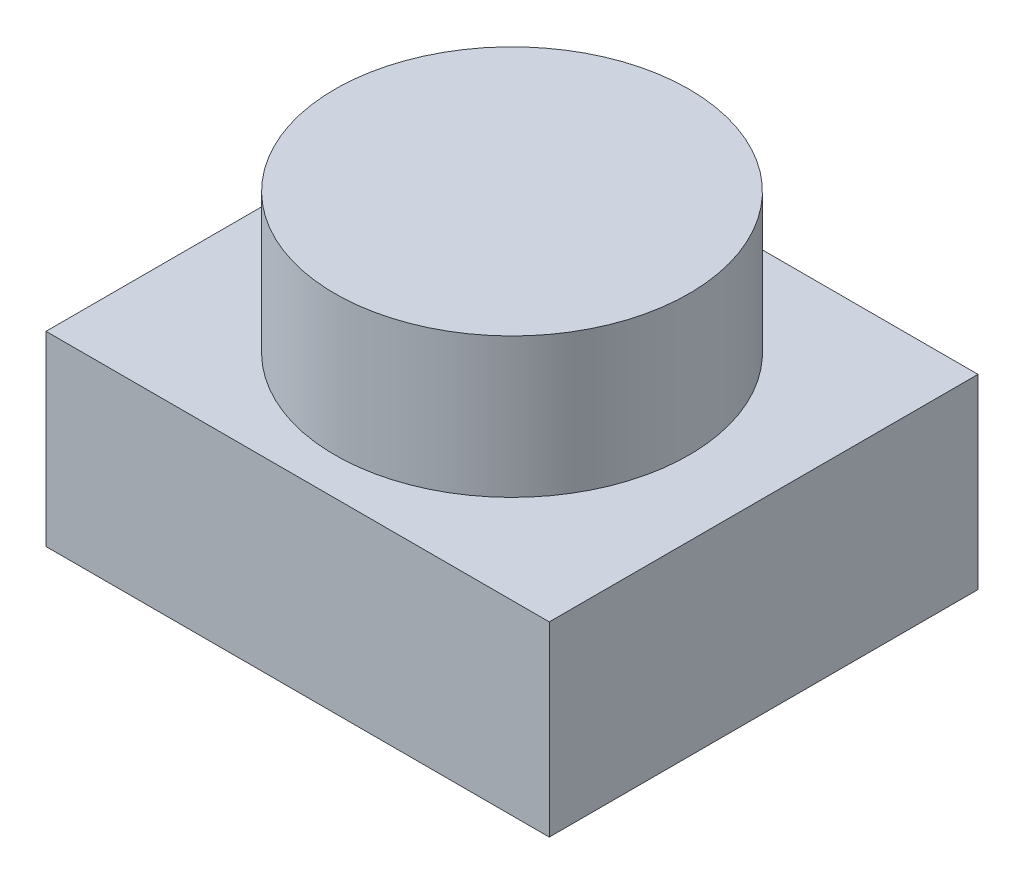
ISO-10303-21;
HEADER;
FILE_DESCRIPTION(('STEP AP214'),'2;1');
FILE_NAME('part.step','',(''),(''),'','','');
FILE_SCHEMA(('AUTOMOTIVE_DESIGN { 1 0 10303 214 1 1 1 1 }'));
ENDSEC;
DATA;
#1=APPLICATION_CONTEXT('core data for automotive mechanical design processes');
#2=APPLICATION_PROTOCOL_DEFINITION('international standard','automotive_design',2000,#1);
#3=PRODUCT_CONTEXT('',#1,'mechanical');
#4=PRODUCT('Part','Part','',(#3));
#5=PRODUCT_RELATED_PRODUCT_CATEGORY('part','',(#4));
#6=PRODUCT_DEFINITION_FORMATION('','',#4);
#7=PRODUCT_DEFINITION_CONTEXT('part definition',#1,'design');
#8=PRODUCT_DEFINITION('design','',#6,#7);
#9=PRODUCT_DEFINITION_SHAPE('','',#8);
#10=(LENGTH_UNIT() NAMED_UNIT(*) SI_UNIT(.MILLI.,.METRE.));
#11=(NAMED_UNIT(*) PLANE_ANGLE_UNIT() SI_UNIT($,.RADIAN.));
#12=(NAMED_UNIT(*) SI_UNIT($,.STERADIAN.) SOLID_ANGLE_UNIT());
#13=UNCERTAINTY_MEASURE_WITH_UNIT(LENGTH_MEASURE(1.E-05),#10,'distance_accuracy_value','');
#14=(GEOMETRIC_REPRESENTATION_CONTEXT(3) GLOBAL_UNCERTAINTY_ASSIGNED_CONTEXT((#13)) GLOBAL_UNIT_ASSIGNED_CONTEXT((#10,
#11,#12)) REPRESENTATION_CONTEXT('',''));
#15=CARTESIAN_POINT('',(0.,0.,0.));
#16=DIRECTION('',(0.,0.,1.));
#17=DIRECTION('',(1.,0.,0.));
#18=AXIS2_PLACEMENT_3D('',#15,#16,#17);
#19=CARTESIAN_POINT('',(-27.,20.,23.));
#20=DIRECTION('',(1.,0.,0.));
#21=DIRECTION('',(0.,0.,-1.));
#22=AXIS2_PLACEMENT_3D('',#19,#20,#21);
#23=PLANE('',#22);
#24=DIRECTION('',(0.,-1.,0.));
#25=VECTOR('',#24,1.);
#26=CARTESIAN_POINT('',(-27.,20.,-23.));
#27=LINE('',#26,#25);
#28=CARTESIAN_POINT('',(-27.,20.,-23.));
#29=VERTEX_POINT('',#28);
#30=CARTESIAN_POINT('',(-27.,0.,-23.));
#31=VERTEX_POINT('',#30);
#32=EDGE_CURVE('E105',#29,#31,#27,.T.);
#33=ORIENTED_EDGE('',*,*,#32,.T.);
#34=DIRECTION('',(0.,0.,-1.));
#35=VECTOR('',#34,1.);
#36=CARTESIAN_POINT('',(-27.,0.,23.));
#37=LINE('',#36,#35);
#38=CARTESIAN_POINT('',(-27.,0.,23.));
#39=VERTEX_POINT('',#38);
#40=EDGE_CURVE('E11',#39,#31,#37,.T.);
#41=ORIENTED_EDGE('',*,*,#40,.F.);
#42=DIRECTION('',(0.,-1.,0.));
#43=VECTOR('',#42,1.);
#44=CARTESIAN_POINT('',(-27.,20.,23.));
#45=LINE('',#44,#43);
#46=CARTESIAN_POINT('',(-27.,20.,23.));
#47=VERTEX_POINT('',#46);
#48=EDGE_CURVE('E89',#47,#39,#45,.T.);
#49=ORIENTED_EDGE('',*,*,#48,.F.);
#50=DIRECTION('',(0.,0.,-1.));
#51=VECTOR('',#50,1.);
#52=CARTESIAN_POINT('',(-27.,20.,23.));
#53=LINE('',#52,#51);
#54=EDGE_CURVE('E98',#47,#29,#53,.T.);
#55=ORIENTED_EDGE('',*,*,#54,.T.);
#56=EDGE_LOOP('',(#33,#41,#49,#55));
#57=FACE_BOUND('',#56,.T.);
#58=ADVANCED_FACE('F39',(#57),#23,.F.);
#59=CARTESIAN_POINT('',(-27.,0.,23.));
#60=DIRECTION('',(0.,1.,0.));
#61=DIRECTION('',(0.,0.,1.));
#62=AXIS2_PLACEMENT_3D('',#59,#60,#61);
#63=PLANE('',#62);
#64=DIRECTION('',(1.,0.,0.));
#65=VECTOR('',#64,1.);
#66=CARTESIAN_POINT('',(-27.,0.,-23.));
#67=LINE('',#66,#65);
#68=CARTESIAN_POINT('',(27.,0.,-23.));
#69=VERTEX_POINT('',#68);
#70=EDGE_CURVE('E94',#31,#69,#67,.T.);
#71=ORIENTED_EDGE('',*,*,#70,.T.);
#72=DIRECTION('',(0.,0.,-1.));
#73=VECTOR('',#72,1.);
#74=CARTESIAN_POINT('',(27.,0.,23.));
#75=LINE('',#74,#73);
#76=CARTESIAN_POINT('',(27.,0.,23.));
#77=VERTEX_POINT('',#76);
#78=EDGE_CURVE('E50',#77,#69,#75,.T.);
#79=ORIENTED_EDGE('',*,*,#78,.F.);
#80=DIRECTION('',(1.,0.,0.));
#81=VECTOR('',#80,1.);
#82=CARTESIAN_POINT('',(-27.,0.,23.));
#83=LINE('',#82,#81);
#84=EDGE_CURVE('E84',#39,#77,#83,.T.);
#85=ORIENTED_EDGE('',*,*,#84,.F.);
#86=ORIENTED_EDGE('',*,*,#40,.T.);
#87=EDGE_LOOP('',(#71,#79,#85,#86));
#88=FACE_BOUND('',#87,.T.);
#89=ADVANCED_FACE('F91',(#88),#63,.F.);
#90=CARTESIAN_POINT('',(27.,0.,23.));
#91=DIRECTION('',(-1.,0.,0.));
#92=DIRECTION('',(0.,0.,1.));
#93=AXIS2_PLACEMENT_3D('',#90,#91,#92);
#94=PLANE('',#93);
#95=DIRECTION('',(0.,1.,0.));
#96=VECTOR('',#95,1.);
#97=CARTESIAN_POINT('',(27.,0.,-23.));
#98=LINE('',#97,#96);
#99=CARTESIAN_POINT('',(27.,20.,-23.));
#100=VERTEX_POINT('',#99);
#101=EDGE_CURVE('E75',#69,#100,#98,.T.);
#102=ORIENTED_EDGE('',*,*,#101,.T.);
#103=DIRECTION('',(0.,0.,-1.));
#104=VECTOR('',#103,1.);
#105=CARTESIAN_POINT('',(27.,20.,23.));
#106=LINE('',#105,#104);
#107=CARTESIAN_POINT('',(27.,20.,23.));
#108=VERTEX_POINT('',#107);
#109=EDGE_CURVE('E92',#108,#100,#106,.T.);
#110=ORIENTED_EDGE('',*,*,#109,.F.);
#111=DIRECTION('',(0.,1.,0.));
#112=VECTOR('',#111,1.);
#113=CARTESIAN_POINT('',(27.,0.,23.));
#114=LINE('',#113,#112);
#115=EDGE_CURVE('E86',#77,#108,#114,.T.);
#116=ORIENTED_EDGE('',*,*,#115,.F.);
#117=ORIENTED_EDGE('',*,*,#78,.T.);
#118=EDGE_LOOP('',(#102,#110,#116,#117));
#119=FACE_BOUND('',#118,.T.);
#120=ADVANCED_FACE('F96',(#119),#94,.F.);
#121=CARTESIAN_POINT('',(27.,20.,23.));
#122=DIRECTION('',(0.,-1.,0.));
#123=DIRECTION('',(0.,0.,-1.));
#124=AXIS2_PLACEMENT_3D('',#121,#122,#123);
#125=PLANE('',#124);
#126=CARTESIAN_POINT('',(0.,20.,0.));
#127=DIRECTION('',(0.,-1.,0.));
#128=DIRECTION('',(0.,0.,-1.));
#129=AXIS2_PLACEMENT_3D('',#126,#127,#128);
#130=CIRCLE('',#129,19.);
#131=CARTESIAN_POINT('',(0.,20.,-19.));
#132=VERTEX_POINT('',#131);
#133=EDGE_CURVE('E104',#132,#132,#130,.T.);
#134=ORIENTED_EDGE('',*,*,#133,.T.);
#135=EDGE_LOOP('',(#134));
#136=FACE_BOUND('',#135,.T.);
#137=DIRECTION('',(-1.,0.,0.));
#138=VECTOR('',#137,1.);
#139=CARTESIAN_POINT('',(27.,20.,-23.));
#140=LINE('',#139,#138);
#141=EDGE_CURVE('E79',#100,#29,#140,.T.);
#142=ORIENTED_EDGE('',*,*,#141,.T.);
#143=ORIENTED_EDGE('',*,*,#54,.F.);
#144=DIRECTION('',(-1.,0.,0.));
#145=VECTOR('',#144,1.);
#146=CARTESIAN_POINT('',(27.,20.,23.));
#147=LINE('',#146,#145);
#148=EDGE_CURVE('E54',#108,#47,#147,.T.);
#149=ORIENTED_EDGE('',*,*,#148,.F.);
#150=ORIENTED_EDGE('',*,*,#109,.T.);
#151=EDGE_LOOP('',(#142,#143,#149,#150));
#152=FACE_BOUND('',#151,.T.);
#153=ADVANCED_FACE('F109',(#136,#152),#125,.F.);
#154=CARTESIAN_POINT('',(0.,0.,23.));
#155=DIRECTION('',(0.,0.,1.));
#156=DIRECTION('',(1.,0.,0.));
#157=AXIS2_PLACEMENT_3D('',#154,#155,#156);
#158=PLANE('',#157);
#159=ORIENTED_EDGE('',*,*,#48,.T.);
#160=ORIENTED_EDGE('',*,*,#84,.T.);
#161=ORIENTED_EDGE('',*,*,#115,.T.);
#162=ORIENTED_EDGE('',*,*,#148,.T.);
#163=EDGE_LOOP('',(#159,#160,#161,#162));
#164=FACE_BOUND('',#163,.T.);
#165=ADVANCED_FACE('F88',(#164),#158,.T.);
#166=CARTESIAN_POINT('',(0.,0.,-23.));
#167=DIRECTION('',(0.,0.,1.));
#168=DIRECTION('',(1.,0.,0.));
#169=AXIS2_PLACEMENT_3D('',#166,#167,#168);
#170=PLANE('',#169);
#171=ORIENTED_EDGE('',*,*,#32,.F.);
#172=ORIENTED_EDGE('',*,*,#141,.F.);
#173=ORIENTED_EDGE('',*,*,#101,.F.);
#174=ORIENTED_EDGE('',*,*,#70,.F.);
#175=EDGE_LOOP('',(#171,#172,#173,#174));
#176=FACE_BOUND('',#175,.T.);
#177=ADVANCED_FACE('F114',(#176),#170,.F.);
#178=CARTESIAN_POINT('',(0.,15.,0.));
#179=DIRECTION('',(0.,-1.,0.));
#180=DIRECTION('',(0.,0.,-1.));
#181=AXIS2_PLACEMENT_3D('',#178,#179,#180);
#182=CYLINDRICAL_SURFACE('',#181,19.);
#183=CARTESIAN_POINT('',(0.,35.,0.));
#184=DIRECTION('',(0.,-1.,0.));
#185=DIRECTION('',(0.,0.,-1.));
#186=AXIS2_PLACEMENT_3D('',#183,#184,#185);
#187=CIRCLE('',#186,19.);
#188=CARTESIAN_POINT('',(0.,35.,-19.));
#189=VERTEX_POINT('',#188);
#190=EDGE_CURVE('E119',#189,#189,#187,.T.);
#191=ORIENTED_EDGE('',*,*,#190,.T.);
#192=EDGE_LOOP('',(#191));
#193=FACE_BOUND('',#192,.T.);
#194=ORIENTED_EDGE('',*,*,#133,.F.);
#195=EDGE_LOOP('',(#194));
#196=FACE_BOUND('',#195,.T.);
#197=ADVANCED_FACE('F125',(#193,#196),#182,.T.);
#198=CARTESIAN_POINT('',(19.,35.,0.));
#199=DIRECTION('',(0.,1.,0.));
#200=DIRECTION('',(0.,0.,1.));
#201=AXIS2_PLACEMENT_3D('',#198,#199,#200);
#202=PLANE('',#201);
#203=ORIENTED_EDGE('',*,*,#190,.F.);
#204=EDGE_LOOP('',(#203));
#205=FACE_BOUND('',#204,.T.);
#206=ADVANCED_FACE('F124',(#205),#202,.T.);
#207=CLOSED_SHELL('',(#58,#89,#120,#153,#165,#177,#197,#206));
#208=MANIFOLD_SOLID_BREP('B2',#207);
#209=ADVANCED_BREP_SHAPE_REPRESENTATION('',(#18,#208),#14);
#210=SHAPE_DEFINITION_REPRESENTATION(#9,#209);
ENDSEC;
END-ISO-10303-21;
